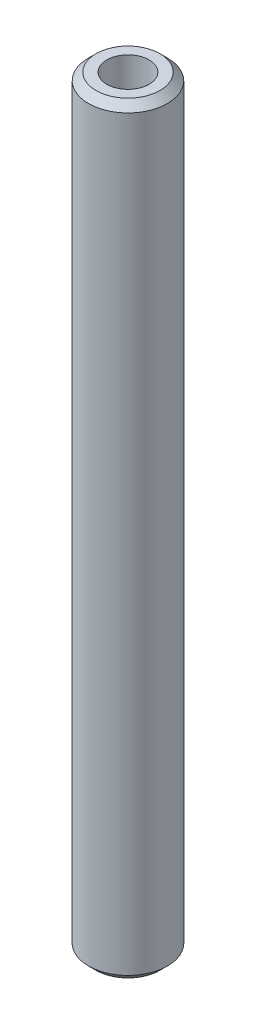
ISO-10303-21;
HEADER;
FILE_DESCRIPTION(('STEP AP214'),'2;1');
FILE_NAME('part.step','',(''),(''),'','','');
FILE_SCHEMA(('AUTOMOTIVE_DESIGN { 1 0 10303 214 1 1 1 1 }'));
ENDSEC;
DATA;
#1=APPLICATION_CONTEXT('core data for automotive mechanical design processes');
#2=APPLICATION_PROTOCOL_DEFINITION('international standard','automotive_design',2000,#1);
#3=PRODUCT_CONTEXT('',#1,'mechanical');
#4=PRODUCT('Part','Part','',(#3));
#5=PRODUCT_RELATED_PRODUCT_CATEGORY('part','',(#4));
#6=PRODUCT_DEFINITION_FORMATION('','',#4);
#7=PRODUCT_DEFINITION_CONTEXT('part definition',#1,'design');
#8=PRODUCT_DEFINITION('design','',#6,#7);
#9=PRODUCT_DEFINITION_SHAPE('','',#8);
#10=(LENGTH_UNIT() NAMED_UNIT(*) SI_UNIT(.MILLI.,.METRE.));
#11=(NAMED_UNIT(*) PLANE_ANGLE_UNIT() SI_UNIT($,.RADIAN.));
#12=(NAMED_UNIT(*) SI_UNIT($,.STERADIAN.) SOLID_ANGLE_UNIT());
#13=UNCERTAINTY_MEASURE_WITH_UNIT(LENGTH_MEASURE(1.E-05),#10,'distance_accuracy_value','');
#14=(GEOMETRIC_REPRESENTATION_CONTEXT(3) GLOBAL_UNCERTAINTY_ASSIGNED_CONTEXT((#13)) GLOBAL_UNIT_ASSIGNED_CONTEXT((#10,
#11,#12)) REPRESENTATION_CONTEXT('',''));
#15=CARTESIAN_POINT('',(0.,0.,0.));
#16=DIRECTION('',(0.,0.,1.));
#17=DIRECTION('',(1.,0.,0.));
#18=AXIS2_PLACEMENT_3D('',#15,#16,#17);
#19=CARTESIAN_POINT('',(0.,530.90154963533,0.));
#20=DIRECTION('',(0.,-1.,0.));
#21=DIRECTION('',(0.,0.,-1.));
#22=AXIS2_PLACEMENT_3D('',#19,#20,#21);
#23=CYLINDRICAL_SURFACE('',#22,27.5);
#24=CARTESIAN_POINT('',(0.,525.66565526248,0.));
#25=DIRECTION('',(0.,1.,0.));
#26=DIRECTION('',(0.,0.,1.));
#27=AXIS2_PLACEMENT_3D('',#24,#25,#26);
#28=CIRCLE('',#27,27.5);
#29=CARTESIAN_POINT('',(0.,525.66565526248,27.5));
#30=VERTEX_POINT('',#29);
#31=EDGE_CURVE('E50',#30,#30,#28,.F.);
#32=ORIENTED_EDGE('',*,*,#31,.T.);
#33=EDGE_LOOP('',(#32));
#34=FACE_BOUND('',#33,.T.);
#35=CARTESIAN_POINT('',(0.,5.23589437285021,0.));
#36=DIRECTION('',(0.,1.,0.));
#37=DIRECTION('',(0.,0.,1.));
#38=AXIS2_PLACEMENT_3D('',#35,#36,#37);
#39=CIRCLE('',#38,27.5);
#40=CARTESIAN_POINT('',(0.,5.23589437285021,27.5));
#41=VERTEX_POINT('',#40);
#42=EDGE_CURVE('E51',#41,#41,#39,.T.);
#43=ORIENTED_EDGE('',*,*,#42,.T.);
#44=EDGE_LOOP('',(#43));
#45=FACE_BOUND('',#44,.T.);
#46=ADVANCED_FACE('F39',(#34,#45),#23,.T.);
#47=CARTESIAN_POINT('',(0.,530.90154963533,0.));
#48=DIRECTION('',(0.,1.,0.));
#49=DIRECTION('',(0.,0.,1.));
#50=AXIS2_PLACEMENT_3D('',#47,#48,#49);
#51=PLANE('',#50);
#52=CARTESIAN_POINT('',(0.,530.90154963533,0.));
#53=DIRECTION('',(0.,1.,0.));
#54=DIRECTION('',(0.,0.,1.));
#55=AXIS2_PLACEMENT_3D('',#52,#53,#54);
#56=CIRCLE('',#55,22.2641056271498);
#57=CARTESIAN_POINT('',(0.,530.90154963533,22.2641056271498));
#58=VERTEX_POINT('',#57);
#59=EDGE_CURVE('E54',#58,#58,#56,.T.);
#60=ORIENTED_EDGE('',*,*,#59,.T.);
#61=EDGE_LOOP('',(#60));
#62=FACE_BOUND('',#61,.T.);
#63=CARTESIAN_POINT('',(0.,530.90154963533,0.));
#64=DIRECTION('',(0.,1.,0.));
#65=DIRECTION('',(0.,0.,1.));
#66=AXIS2_PLACEMENT_3D('',#63,#64,#65);
#67=CIRCLE('',#66,14.7454068352669);
#68=CARTESIAN_POINT('',(0.,530.90154963533,14.7454068352669));
#69=VERTEX_POINT('',#68);
#70=EDGE_CURVE('E58',#69,#69,#67,.T.);
#71=ORIENTED_EDGE('',*,*,#70,.F.);
#72=EDGE_LOOP('',(#71));
#73=FACE_BOUND('',#72,.T.);
#74=ADVANCED_FACE('F69',(#62,#73),#51,.T.);
#75=CARTESIAN_POINT('',(0.,0.,0.));
#76=DIRECTION('',(0.,1.,0.));
#77=DIRECTION('',(0.,0.,1.));
#78=AXIS2_PLACEMENT_3D('',#75,#76,#77);
#79=PLANE('',#78);
#80=CARTESIAN_POINT('',(0.,0.,0.));
#81=DIRECTION('',(0.,1.,0.));
#82=DIRECTION('',(0.,0.,1.));
#83=AXIS2_PLACEMENT_3D('',#80,#81,#82);
#84=CIRCLE('',#83,22.2641056271499);
#85=CARTESIAN_POINT('',(0.,0.,22.2641056271499));
#86=VERTEX_POINT('',#85);
#87=EDGE_CURVE('E10',#86,#86,#84,.F.);
#88=ORIENTED_EDGE('',*,*,#87,.T.);
#89=EDGE_LOOP('',(#88));
#90=FACE_BOUND('',#89,.T.);
#91=CARTESIAN_POINT('',(0.,0.,0.));
#92=DIRECTION('',(0.,1.,0.));
#93=DIRECTION('',(0.,0.,1.));
#94=AXIS2_PLACEMENT_3D('',#91,#92,#93);
#95=CIRCLE('',#94,14.7454068352669);
#96=CARTESIAN_POINT('',(0.,0.,14.7454068352669));
#97=VERTEX_POINT('',#96);
#98=EDGE_CURVE('E63',#97,#97,#95,.T.);
#99=ORIENTED_EDGE('',*,*,#98,.T.);
#100=EDGE_LOOP('',(#99));
#101=FACE_BOUND('',#100,.T.);
#102=ADVANCED_FACE('F75',(#90,#101),#79,.F.);
#103=CARTESIAN_POINT('',(0.,530.90154963533,0.));
#104=DIRECTION('',(0.,-1.,0.));
#105=DIRECTION('',(0.,0.,-1.));
#106=AXIS2_PLACEMENT_3D('',#103,#104,#105);
#107=CYLINDRICAL_SURFACE('',#106,14.7454068352669);
#108=ORIENTED_EDGE('',*,*,#70,.T.);
#109=EDGE_LOOP('',(#108));
#110=FACE_BOUND('',#109,.T.);
#111=ORIENTED_EDGE('',*,*,#98,.F.);
#112=EDGE_LOOP('',(#111));
#113=FACE_BOUND('',#112,.T.);
#114=ADVANCED_FACE('F70',(#110,#113),#107,.F.);
#115=CARTESIAN_POINT('',(0.,530.90154963533,0.));
#116=DIRECTION('',(0.,-1.,0.));
#117=DIRECTION('',(0.,0.,-1.));
#118=AXIS2_PLACEMENT_3D('',#115,#116,#117);
#119=CONICAL_SURFACE('',#118,22.2641056271498,0.785398163397441);
#120=ORIENTED_EDGE('',*,*,#31,.F.);
#121=EDGE_LOOP('',(#120));
#122=FACE_BOUND('',#121,.T.);
#123=ORIENTED_EDGE('',*,*,#59,.F.);
#124=EDGE_LOOP('',(#123));
#125=FACE_BOUND('',#124,.T.);
#126=ADVANCED_FACE('F81',(#122,#125),#119,.T.);
#127=CARTESIAN_POINT('',(0.,5.23589437285021,0.));
#128=DIRECTION('',(0.,1.,0.));
#129=DIRECTION('',(0.,0.,1.));
#130=AXIS2_PLACEMENT_3D('',#127,#128,#129);
#131=CONICAL_SURFACE('',#130,27.5,0.785398163397441);
#132=ORIENTED_EDGE('',*,*,#87,.F.);
#133=EDGE_LOOP('',(#132));
#134=FACE_BOUND('',#133,.T.);
#135=ORIENTED_EDGE('',*,*,#42,.F.);
#136=EDGE_LOOP('',(#135));
#137=FACE_BOUND('',#136,.T.);
#138=ADVANCED_FACE('F45',(#134,#137),#131,.T.);
#139=CLOSED_SHELL('',(#46,#74,#102,#114,#126,#138));
#140=MANIFOLD_SOLID_BREP('B2',#139);
#141=ADVANCED_BREP_SHAPE_REPRESENTATION('',(#18,#140),#14);
#142=SHAPE_DEFINITION_REPRESENTATION(#9,#141);
ENDSEC;
END-ISO-10303-21;
